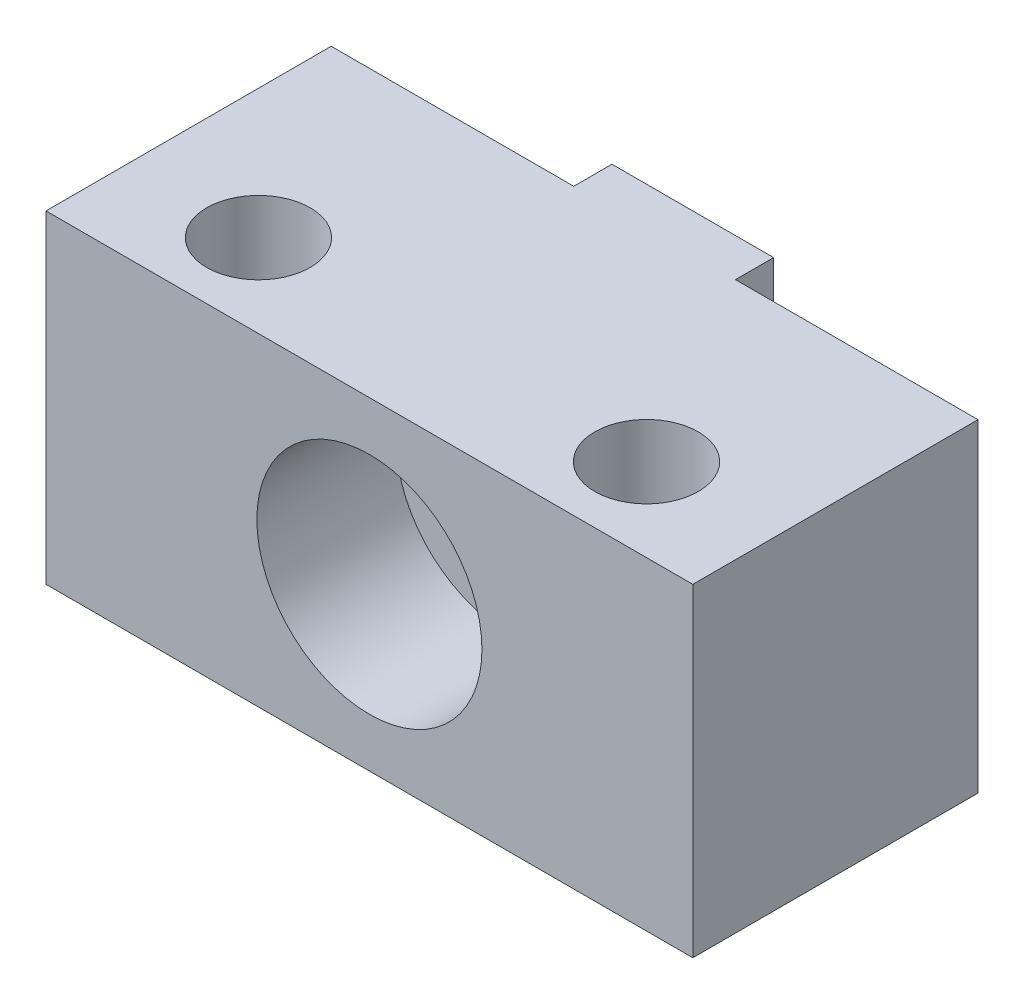
ISO-10303-21;
HEADER;
FILE_DESCRIPTION(('STEP AP214'),'2;1');
FILE_NAME('part.step','',(''),(''),'','','');
FILE_SCHEMA(('AUTOMOTIVE_DESIGN { 1 0 10303 214 1 1 1 1 }'));
ENDSEC;
DATA;
#1=APPLICATION_CONTEXT('core data for automotive mechanical design processes');
#2=APPLICATION_PROTOCOL_DEFINITION('international standard','automotive_design',2000,#1);
#3=PRODUCT_CONTEXT('',#1,'mechanical');
#4=PRODUCT('Part','Part','',(#3));
#5=PRODUCT_RELATED_PRODUCT_CATEGORY('part','',(#4));
#6=PRODUCT_DEFINITION_FORMATION('','',#4);
#7=PRODUCT_DEFINITION_CONTEXT('part definition',#1,'design');
#8=PRODUCT_DEFINITION('design','',#6,#7);
#9=PRODUCT_DEFINITION_SHAPE('','',#8);
#10=(LENGTH_UNIT() NAMED_UNIT(*) SI_UNIT(.MILLI.,.METRE.));
#11=(NAMED_UNIT(*) PLANE_ANGLE_UNIT() SI_UNIT($,.RADIAN.));
#12=(NAMED_UNIT(*) SI_UNIT($,.STERADIAN.) SOLID_ANGLE_UNIT());
#13=UNCERTAINTY_MEASURE_WITH_UNIT(LENGTH_MEASURE(1.E-05),#10,'distance_accuracy_value','');
#14=(GEOMETRIC_REPRESENTATION_CONTEXT(3) GLOBAL_UNCERTAINTY_ASSIGNED_CONTEXT((#13)) GLOBAL_UNIT_ASSIGNED_CONTEXT((#10,
#11,#12)) REPRESENTATION_CONTEXT('',''));
#15=CARTESIAN_POINT('',(0.,0.,0.));
#16=DIRECTION('',(0.,0.,1.));
#17=DIRECTION('',(1.,0.,0.));
#18=AXIS2_PLACEMENT_3D('',#15,#16,#17);
#19=CARTESIAN_POINT('',(0.,6.35,11.2));
#20=DIRECTION('',(0.,0.,1.));
#21=DIRECTION('',(1.,0.,0.));
#22=AXIS2_PLACEMENT_3D('',#19,#20,#21);
#23=CYLINDRICAL_SURFACE('',#22,4.4196);
#24=CARTESIAN_POINT('',(0.,6.35,11.2));
#25=DIRECTION('',(0.,0.,1.));
#26=DIRECTION('',(1.,0.,0.));
#27=AXIS2_PLACEMENT_3D('',#24,#25,#26);
#28=CIRCLE('',#27,4.4196);
#29=CARTESIAN_POINT('',(-4.4196,6.35,11.2));
#30=VERTEX_POINT('',#29);
#31=EDGE_CURVE('E11',#30,#30,#28,.T.);
#32=ORIENTED_EDGE('',*,*,#31,.T.);
#33=DIRECTION('',(0.,0.,-1.));
#34=VECTOR('',#33,1.);
#35=CARTESIAN_POINT('',(-4.4196,6.35,11.2));
#36=LINE('',#35,#34);
#37=CARTESIAN_POINT('',(-4.4196,6.35,5.739));
#38=VERTEX_POINT('',#37);
#39=EDGE_CURVE('E27',#30,#38,#36,.T.);
#40=ORIENTED_EDGE('',*,*,#39,.T.);
#41=CARTESIAN_POINT('',(0.,6.35,5.739));
#42=DIRECTION('',(0.,0.,1.));
#43=DIRECTION('',(1.,0.,0.));
#44=AXIS2_PLACEMENT_3D('',#41,#42,#43);
#45=CIRCLE('',#44,4.4196);
#46=EDGE_CURVE('E20',#38,#38,#45,.T.);
#47=ORIENTED_EDGE('',*,*,#46,.F.);
#48=ORIENTED_EDGE('',*,*,#39,.F.);
#49=EDGE_LOOP('',(#32,#40,#47,#48));
#50=FACE_BOUND('',#49,.T.);
#51=ADVANCED_FACE('F16',(#50),#23,.F.);
#52=CARTESIAN_POINT('',(0.,6.35,5.739));
#53=DIRECTION('',(0.,0.,-1.));
#54=DIRECTION('',(-1.,0.,0.));
#55=AXIS2_PLACEMENT_3D('',#52,#53,#54);
#56=PLANE('',#55);
#57=ORIENTED_EDGE('',*,*,#46,.T.);
#58=EDGE_LOOP('',(#57));
#59=FACE_BOUND('',#58,.T.);
#60=CARTESIAN_POINT('',(0.,6.35,5.739));
#61=DIRECTION('',(0.,0.,-1.));
#62=DIRECTION('',(1.,0.,0.));
#63=AXIS2_PLACEMENT_3D('',#60,#61,#62);
#64=CIRCLE('',#63,2.5);
#65=CARTESIAN_POINT('',(-2.5,6.35,5.739));
#66=VERTEX_POINT('',#65);
#67=EDGE_CURVE('E188',#66,#66,#64,.T.);
#68=ORIENTED_EDGE('',*,*,#67,.T.);
#69=EDGE_LOOP('',(#68));
#70=FACE_BOUND('',#69,.T.);
#71=ADVANCED_FACE('F316',(#59,#70),#56,.F.);
#72=CARTESIAN_POINT('',(0.,6.35,11.2));
#73=DIRECTION('',(0.,0.,1.));
#74=DIRECTION('',(1.,0.,0.));
#75=AXIS2_PLACEMENT_3D('',#72,#73,#74);
#76=CYLINDRICAL_SURFACE('',#75,2.5);
#77=ORIENTED_EDGE('',*,*,#67,.F.);
#78=DIRECTION('',(0.,0.,-1.));
#79=VECTOR('',#78,1.);
#80=CARTESIAN_POINT('',(-2.5,6.35,11.2));
#81=LINE('',#80,#79);
#82=CARTESIAN_POINT('',(-2.5,6.35,-1.5));
#83=VERTEX_POINT('',#82);
#84=EDGE_CURVE('E164',#66,#83,#81,.T.);
#85=ORIENTED_EDGE('',*,*,#84,.T.);
#86=CARTESIAN_POINT('',(0.,6.35,-1.5));
#87=DIRECTION('',(0.,0.,-1.));
#88=DIRECTION('',(1.,0.,0.));
#89=AXIS2_PLACEMENT_3D('',#86,#87,#88);
#90=CIRCLE('',#89,2.5);
#91=EDGE_CURVE('E157',#83,#83,#90,.T.);
#92=ORIENTED_EDGE('',*,*,#91,.T.);
#93=ORIENTED_EDGE('',*,*,#84,.F.);
#94=EDGE_LOOP('',(#77,#85,#92,#93));
#95=FACE_BOUND('',#94,.T.);
#96=ADVANCED_FACE('F322',(#95),#76,.F.);
#97=CARTESIAN_POINT('',(-7.62,0.,7.9375));
#98=DIRECTION('',(0.,-1.,0.));
#99=DIRECTION('',(1.,0.,0.));
#100=AXIS2_PLACEMENT_3D('',#97,#98,#99);
#101=CYLINDRICAL_SURFACE('',#100,2.032);
#102=CARTESIAN_POINT('',(-7.62,0.,7.9375));
#103=DIRECTION('',(0.,1.,0.));
#104=DIRECTION('',(1.,0.,0.));
#105=AXIS2_PLACEMENT_3D('',#102,#103,#104);
#106=CIRCLE('',#105,2.032);
#107=CARTESIAN_POINT('',(-9.652,0.,7.9375));
#108=VERTEX_POINT('',#107);
#109=EDGE_CURVE('E141',#108,#108,#106,.T.);
#110=ORIENTED_EDGE('',*,*,#109,.F.);
#111=DIRECTION('',(0.,1.,0.));
#112=VECTOR('',#111,1.);
#113=CARTESIAN_POINT('',(-9.652,0.,7.9375));
#114=LINE('',#113,#112);
#115=CARTESIAN_POINT('',(-9.652,12.7,7.9375));
#116=VERTEX_POINT('',#115);
#117=EDGE_CURVE('E152',#108,#116,#114,.T.);
#118=ORIENTED_EDGE('',*,*,#117,.T.);
#119=CARTESIAN_POINT('',(-7.62,12.7,7.9375));
#120=DIRECTION('',(0.,1.,0.));
#121=DIRECTION('',(1.,0.,0.));
#122=AXIS2_PLACEMENT_3D('',#119,#120,#121);
#123=CIRCLE('',#122,2.032);
#124=EDGE_CURVE('E149',#116,#116,#123,.T.);
#125=ORIENTED_EDGE('',*,*,#124,.T.);
#126=ORIENTED_EDGE('',*,*,#117,.F.);
#127=EDGE_LOOP('',(#110,#118,#125,#126));
#128=FACE_BOUND('',#127,.T.);
#129=ADVANCED_FACE('F155',(#128),#101,.F.);
#130=CARTESIAN_POINT('',(7.62,0.,7.9375));
#131=DIRECTION('',(0.,-1.,0.));
#132=DIRECTION('',(1.,0.,0.));
#133=AXIS2_PLACEMENT_3D('',#130,#131,#132);
#134=CYLINDRICAL_SURFACE('',#133,2.032);
#135=CARTESIAN_POINT('',(7.62,0.,7.9375));
#136=DIRECTION('',(0.,1.,0.));
#137=DIRECTION('',(1.,0.,0.));
#138=AXIS2_PLACEMENT_3D('',#135,#136,#137);
#139=CIRCLE('',#138,2.032);
#140=CARTESIAN_POINT('',(5.588,0.,7.9375));
#141=VERTEX_POINT('',#140);
#142=EDGE_CURVE('E185',#141,#141,#139,.T.);
#143=ORIENTED_EDGE('',*,*,#142,.F.);
#144=DIRECTION('',(0.,1.,0.));
#145=VECTOR('',#144,1.);
#146=CARTESIAN_POINT('',(5.588,0.,7.9375));
#147=LINE('',#146,#145);
#148=CARTESIAN_POINT('',(5.588,12.7,7.9375));
#149=VERTEX_POINT('',#148);
#150=EDGE_CURVE('E153',#141,#149,#147,.T.);
#151=ORIENTED_EDGE('',*,*,#150,.T.);
#152=CARTESIAN_POINT('',(7.62,12.7,7.9375));
#153=DIRECTION('',(0.,1.,0.));
#154=DIRECTION('',(1.,0.,0.));
#155=AXIS2_PLACEMENT_3D('',#152,#153,#154);
#156=CIRCLE('',#155,2.032);
#157=EDGE_CURVE('E289',#149,#149,#156,.T.);
#158=ORIENTED_EDGE('',*,*,#157,.T.);
#159=ORIENTED_EDGE('',*,*,#150,.F.);
#160=EDGE_LOOP('',(#143,#151,#158,#159));
#161=FACE_BOUND('',#160,.T.);
#162=ADVANCED_FACE('F18',(#161),#134,.F.);
#163=CARTESIAN_POINT('',(-12.7,0.,11.2));
#164=DIRECTION('',(1.,0.,0.));
#165=DIRECTION('',(0.,1.,0.));
#166=AXIS2_PLACEMENT_3D('',#163,#164,#165);
#167=PLANE('',#166);
#168=DIRECTION('',(0.,0.,-1.));
#169=VECTOR('',#168,1.);
#170=CARTESIAN_POINT('',(-12.7,0.,11.2));
#171=LINE('',#170,#169);
#172=CARTESIAN_POINT('',(-12.7,0.,11.2));
#173=VERTEX_POINT('',#172);
#174=CARTESIAN_POINT('',(-12.7,0.,0.));
#175=VERTEX_POINT('',#174);
#176=EDGE_CURVE('E99',#173,#175,#171,.T.);
#177=ORIENTED_EDGE('',*,*,#176,.F.);
#178=DIRECTION('',(0.,1.,0.));
#179=VECTOR('',#178,1.);
#180=CARTESIAN_POINT('',(-12.7,0.,11.2));
#181=LINE('',#180,#179);
#182=CARTESIAN_POINT('',(-12.7,12.7,11.2));
#183=VERTEX_POINT('',#182);
#184=EDGE_CURVE('E180',#173,#183,#181,.T.);
#185=ORIENTED_EDGE('',*,*,#184,.T.);
#186=DIRECTION('',(0.,0.,-1.));
#187=VECTOR('',#186,1.);
#188=CARTESIAN_POINT('',(-12.7,12.7,11.2));
#189=LINE('',#188,#187);
#190=CARTESIAN_POINT('',(-12.7,12.7,0.));
#191=VERTEX_POINT('',#190);
#192=EDGE_CURVE('E75',#183,#191,#189,.T.);
#193=ORIENTED_EDGE('',*,*,#192,.T.);
#194=DIRECTION('',(0.,1.,0.));
#195=VECTOR('',#194,1.);
#196=CARTESIAN_POINT('',(-12.7,0.,0.));
#197=LINE('',#196,#195);
#198=EDGE_CURVE('E88',#175,#191,#197,.T.);
#199=ORIENTED_EDGE('',*,*,#198,.F.);
#200=EDGE_LOOP('',(#177,#185,#193,#199));
#201=FACE_BOUND('',#200,.T.);
#202=ADVANCED_FACE('F311',(#201),#167,.F.);
#203=CARTESIAN_POINT('',(12.7,0.,11.2));
#204=DIRECTION('',(0.,0.,-1.));
#205=DIRECTION('',(-1.,0.,0.));
#206=AXIS2_PLACEMENT_3D('',#203,#204,#205);
#207=PLANE('',#206);
#208=DIRECTION('',(-1.,0.,0.));
#209=VECTOR('',#208,1.);
#210=CARTESIAN_POINT('',(12.7,0.,11.2));
#211=LINE('',#210,#209);
#212=CARTESIAN_POINT('',(12.7,0.,11.2));
#213=VERTEX_POINT('',#212);
#214=EDGE_CURVE('E216',#213,#173,#211,.T.);
#215=ORIENTED_EDGE('',*,*,#214,.F.);
#216=DIRECTION('',(0.,1.,0.));
#217=VECTOR('',#216,1.);
#218=CARTESIAN_POINT('',(12.7,0.,11.2));
#219=LINE('',#218,#217);
#220=CARTESIAN_POINT('',(12.7,12.7,11.2));
#221=VERTEX_POINT('',#220);
#222=EDGE_CURVE('E175',#213,#221,#219,.T.);
#223=ORIENTED_EDGE('',*,*,#222,.T.);
#224=DIRECTION('',(-1.,0.,0.));
#225=VECTOR('',#224,1.);
#226=CARTESIAN_POINT('',(12.7,12.7,11.2));
#227=LINE('',#226,#225);
#228=EDGE_CURVE('E172',#221,#183,#227,.T.);
#229=ORIENTED_EDGE('',*,*,#228,.T.);
#230=ORIENTED_EDGE('',*,*,#184,.F.);
#231=EDGE_LOOP('',(#215,#223,#229,#230));
#232=FACE_BOUND('',#231,.T.);
#233=ORIENTED_EDGE('',*,*,#31,.F.);
#234=EDGE_LOOP('',(#233));
#235=FACE_BOUND('',#234,.T.);
#236=ADVANCED_FACE('F299',(#232,#235),#207,.F.);
#237=CARTESIAN_POINT('',(12.7,0.,0.));
#238=DIRECTION('',(-1.,0.,0.));
#239=DIRECTION('',(0.,1.,0.));
#240=AXIS2_PLACEMENT_3D('',#237,#238,#239);
#241=PLANE('',#240);
#242=DIRECTION('',(0.,0.,1.));
#243=VECTOR('',#242,1.);
#244=CARTESIAN_POINT('',(12.7,0.,0.));
#245=LINE('',#244,#243);
#246=CARTESIAN_POINT('',(12.7,0.,0.));
#247=VERTEX_POINT('',#246);
#248=EDGE_CURVE('E219',#247,#213,#245,.T.);
#249=ORIENTED_EDGE('',*,*,#248,.F.);
#250=DIRECTION('',(0.,1.,0.));
#251=VECTOR('',#250,1.);
#252=CARTESIAN_POINT('',(12.7,0.,0.));
#253=LINE('',#252,#251);
#254=CARTESIAN_POINT('',(12.7,12.7,0.));
#255=VERTEX_POINT('',#254);
#256=EDGE_CURVE('E176',#247,#255,#253,.T.);
#257=ORIENTED_EDGE('',*,*,#256,.T.);
#258=DIRECTION('',(0.,0.,1.));
#259=VECTOR('',#258,1.);
#260=CARTESIAN_POINT('',(12.7,12.7,0.));
#261=LINE('',#260,#259);
#262=EDGE_CURVE('E209',#255,#221,#261,.T.);
#263=ORIENTED_EDGE('',*,*,#262,.T.);
#264=ORIENTED_EDGE('',*,*,#222,.F.);
#265=EDGE_LOOP('',(#249,#257,#263,#264));
#266=FACE_BOUND('',#265,.T.);
#267=ADVANCED_FACE('F302',(#266),#241,.F.);
#268=CARTESIAN_POINT('',(3.175,0.,0.));
#269=DIRECTION('',(0.,0.,1.));
#270=DIRECTION('',(1.,0.,0.));
#271=AXIS2_PLACEMENT_3D('',#268,#269,#270);
#272=PLANE('',#271);
#273=DIRECTION('',(1.,0.,0.));
#274=VECTOR('',#273,1.);
#275=CARTESIAN_POINT('',(3.175,0.,0.));
#276=LINE('',#275,#274);
#277=CARTESIAN_POINT('',(3.175,0.,0.));
#278=VERTEX_POINT('',#277);
#279=EDGE_CURVE('E244',#278,#247,#276,.T.);
#280=ORIENTED_EDGE('',*,*,#279,.F.);
#281=DIRECTION('',(0.,1.,0.));
#282=VECTOR('',#281,1.);
#283=CARTESIAN_POINT('',(3.175,0.,0.));
#284=LINE('',#283,#282);
#285=CARTESIAN_POINT('',(3.175,12.7,0.));
#286=VERTEX_POINT('',#285);
#287=EDGE_CURVE('E183',#278,#286,#284,.T.);
#288=ORIENTED_EDGE('',*,*,#287,.T.);
#289=DIRECTION('',(1.,0.,0.));
#290=VECTOR('',#289,1.);
#291=CARTESIAN_POINT('',(3.175,12.7,0.));
#292=LINE('',#291,#290);
#293=EDGE_CURVE('E110',#286,#255,#292,.T.);
#294=ORIENTED_EDGE('',*,*,#293,.T.);
#295=ORIENTED_EDGE('',*,*,#256,.F.);
#296=EDGE_LOOP('',(#280,#288,#294,#295));
#297=FACE_BOUND('',#296,.T.);
#298=ADVANCED_FACE('F258',(#297),#272,.F.);
#299=CARTESIAN_POINT('',(3.175,0.,-1.5));
#300=DIRECTION('',(-1.,0.,0.));
#301=DIRECTION('',(0.,1.,0.));
#302=AXIS2_PLACEMENT_3D('',#299,#300,#301);
#303=PLANE('',#302);
#304=DIRECTION('',(0.,0.,1.));
#305=VECTOR('',#304,1.);
#306=CARTESIAN_POINT('',(3.175,0.,-1.5));
#307=LINE('',#306,#305);
#308=CARTESIAN_POINT('',(3.175,0.,-1.5));
#309=VERTEX_POINT('',#308);
#310=EDGE_CURVE('E126',#309,#278,#307,.T.);
#311=ORIENTED_EDGE('',*,*,#310,.F.);
#312=DIRECTION('',(0.,1.,0.));
#313=VECTOR('',#312,1.);
#314=CARTESIAN_POINT('',(3.175,0.,-1.5));
#315=LINE('',#314,#313);
#316=CARTESIAN_POINT('',(3.175,12.7,-1.5));
#317=VERTEX_POINT('',#316);
#318=EDGE_CURVE('E184',#309,#317,#315,.T.);
#319=ORIENTED_EDGE('',*,*,#318,.T.);
#320=DIRECTION('',(0.,0.,1.));
#321=VECTOR('',#320,1.);
#322=CARTESIAN_POINT('',(3.175,12.7,-1.5));
#323=LINE('',#322,#321);
#324=EDGE_CURVE('E227',#317,#286,#323,.T.);
#325=ORIENTED_EDGE('',*,*,#324,.T.);
#326=ORIENTED_EDGE('',*,*,#287,.F.);
#327=EDGE_LOOP('',(#311,#319,#325,#326));
#328=FACE_BOUND('',#327,.T.);
#329=ADVANCED_FACE('F259',(#328),#303,.F.);
#330=CARTESIAN_POINT('',(-3.175,0.,-1.5));
#331=DIRECTION('',(0.,0.,1.));
#332=DIRECTION('',(1.,0.,0.));
#333=AXIS2_PLACEMENT_3D('',#330,#331,#332);
#334=PLANE('',#333);
#335=DIRECTION('',(1.,0.,0.));
#336=VECTOR('',#335,1.);
#337=CARTESIAN_POINT('',(-3.175,0.,-1.5));
#338=LINE('',#337,#336);
#339=CARTESIAN_POINT('',(-3.175,0.,-1.5));
#340=VERTEX_POINT('',#339);
#341=EDGE_CURVE('E220',#340,#309,#338,.T.);
#342=ORIENTED_EDGE('',*,*,#341,.F.);
#343=DIRECTION('',(0.,1.,0.));
#344=VECTOR('',#343,1.);
#345=CARTESIAN_POINT('',(-3.175,0.,-1.5));
#346=LINE('',#345,#344);
#347=CARTESIAN_POINT('',(-3.175,12.7,-1.5));
#348=VERTEX_POINT('',#347);
#349=EDGE_CURVE('E231',#340,#348,#346,.T.);
#350=ORIENTED_EDGE('',*,*,#349,.T.);
#351=DIRECTION('',(1.,0.,0.));
#352=VECTOR('',#351,1.);
#353=CARTESIAN_POINT('',(-3.175,12.7,-1.5));
#354=LINE('',#353,#352);
#355=EDGE_CURVE('E239',#348,#317,#354,.T.);
#356=ORIENTED_EDGE('',*,*,#355,.T.);
#357=ORIENTED_EDGE('',*,*,#318,.F.);
#358=EDGE_LOOP('',(#342,#350,#356,#357));
#359=FACE_BOUND('',#358,.T.);
#360=ORIENTED_EDGE('',*,*,#91,.F.);
#361=EDGE_LOOP('',(#360));
#362=FACE_BOUND('',#361,.T.);
#363=ADVANCED_FACE('F270',(#359,#362),#334,.F.);
#364=CARTESIAN_POINT('',(-3.175,0.,0.));
#365=DIRECTION('',(1.,0.,0.));
#366=DIRECTION('',(0.,1.,0.));
#367=AXIS2_PLACEMENT_3D('',#364,#365,#366);
#368=PLANE('',#367);
#369=DIRECTION('',(0.,0.,-1.));
#370=VECTOR('',#369,1.);
#371=CARTESIAN_POINT('',(-3.175,0.,0.));
#372=LINE('',#371,#370);
#373=CARTESIAN_POINT('',(-3.175,0.,0.));
#374=VERTEX_POINT('',#373);
#375=EDGE_CURVE('E215',#374,#340,#372,.T.);
#376=ORIENTED_EDGE('',*,*,#375,.F.);
#377=DIRECTION('',(0.,1.,0.));
#378=VECTOR('',#377,1.);
#379=CARTESIAN_POINT('',(-3.175,0.,0.));
#380=LINE('',#379,#378);
#381=CARTESIAN_POINT('',(-3.175,12.7,0.));
#382=VERTEX_POINT('',#381);
#383=EDGE_CURVE('E235',#374,#382,#380,.T.);
#384=ORIENTED_EDGE('',*,*,#383,.T.);
#385=DIRECTION('',(0.,0.,-1.));
#386=VECTOR('',#385,1.);
#387=CARTESIAN_POINT('',(-3.175,12.7,0.));
#388=LINE('',#387,#386);
#389=EDGE_CURVE('E170',#382,#348,#388,.T.);
#390=ORIENTED_EDGE('',*,*,#389,.T.);
#391=ORIENTED_EDGE('',*,*,#349,.F.);
#392=EDGE_LOOP('',(#376,#384,#390,#391));
#393=FACE_BOUND('',#392,.T.);
#394=ADVANCED_FACE('F277',(#393),#368,.F.);
#395=CARTESIAN_POINT('',(-12.7,0.,0.));
#396=DIRECTION('',(0.,0.,1.));
#397=DIRECTION('',(1.,0.,0.));
#398=AXIS2_PLACEMENT_3D('',#395,#396,#397);
#399=PLANE('',#398);
#400=DIRECTION('',(1.,0.,0.));
#401=VECTOR('',#400,1.);
#402=CARTESIAN_POINT('',(-12.7,0.,0.));
#403=LINE('',#402,#401);
#404=EDGE_CURVE('E212',#175,#374,#403,.T.);
#405=ORIENTED_EDGE('',*,*,#404,.F.);
#406=ORIENTED_EDGE('',*,*,#198,.T.);
#407=DIRECTION('',(1.,0.,0.));
#408=VECTOR('',#407,1.);
#409=CARTESIAN_POINT('',(-12.7,12.7,0.));
#410=LINE('',#409,#408);
#411=EDGE_CURVE('E171',#191,#382,#410,.T.);
#412=ORIENTED_EDGE('',*,*,#411,.T.);
#413=ORIENTED_EDGE('',*,*,#383,.F.);
#414=EDGE_LOOP('',(#405,#406,#412,#413));
#415=FACE_BOUND('',#414,.T.);
#416=ADVANCED_FACE('F281',(#415),#399,.F.);
#417=CARTESIAN_POINT('',(0.,12.7,4.85));
#418=DIRECTION('',(0.,-1.,0.));
#419=DIRECTION('',(0.,0.,-1.));
#420=AXIS2_PLACEMENT_3D('',#417,#418,#419);
#421=PLANE('',#420);
#422=ORIENTED_EDGE('',*,*,#411,.F.);
#423=ORIENTED_EDGE('',*,*,#192,.F.);
#424=ORIENTED_EDGE('',*,*,#228,.F.);
#425=ORIENTED_EDGE('',*,*,#262,.F.);
#426=ORIENTED_EDGE('',*,*,#293,.F.);
#427=ORIENTED_EDGE('',*,*,#324,.F.);
#428=ORIENTED_EDGE('',*,*,#355,.F.);
#429=ORIENTED_EDGE('',*,*,#389,.F.);
#430=EDGE_LOOP('',(#422,#423,#424,#425,#426,#427,#428,#429));
#431=FACE_BOUND('',#430,.T.);
#432=ORIENTED_EDGE('',*,*,#157,.F.);
#433=EDGE_LOOP('',(#432));
#434=FACE_BOUND('',#433,.T.);
#435=ORIENTED_EDGE('',*,*,#124,.F.);
#436=EDGE_LOOP('',(#435));
#437=FACE_BOUND('',#436,.T.);
#438=ADVANCED_FACE('F150',(#431,#434,#437),#421,.F.);
#439=CARTESIAN_POINT('',(0.,0.,4.85));
#440=DIRECTION('',(0.,-1.,0.));
#441=DIRECTION('',(0.,0.,-1.));
#442=AXIS2_PLACEMENT_3D('',#439,#440,#441);
#443=PLANE('',#442);
#444=ORIENTED_EDGE('',*,*,#404,.T.);
#445=ORIENTED_EDGE('',*,*,#375,.T.);
#446=ORIENTED_EDGE('',*,*,#341,.T.);
#447=ORIENTED_EDGE('',*,*,#310,.T.);
#448=ORIENTED_EDGE('',*,*,#279,.T.);
#449=ORIENTED_EDGE('',*,*,#248,.T.);
#450=ORIENTED_EDGE('',*,*,#214,.T.);
#451=ORIENTED_EDGE('',*,*,#176,.T.);
#452=EDGE_LOOP('',(#444,#445,#446,#447,#448,#449,#450,#451));
#453=FACE_BOUND('',#452,.T.);
#454=ORIENTED_EDGE('',*,*,#142,.T.);
#455=EDGE_LOOP('',(#454));
#456=FACE_BOUND('',#455,.T.);
#457=ORIENTED_EDGE('',*,*,#109,.T.);
#458=EDGE_LOOP('',(#457));
#459=FACE_BOUND('',#458,.T.);
#460=ADVANCED_FACE('F253',(#453,#456,#459),#443,.T.);
#461=CLOSED_SHELL('',(#51,#71,#96,#129,#162,#202,#236,#267,#298,#329,#363,#394,#416,#438,#460));
#462=MANIFOLD_SOLID_BREP('B1',#461);
#463=ADVANCED_BREP_SHAPE_REPRESENTATION('',(#18,#462),#14);
#464=SHAPE_DEFINITION_REPRESENTATION(#9,#463);
ENDSEC;
END-ISO-10303-21;
